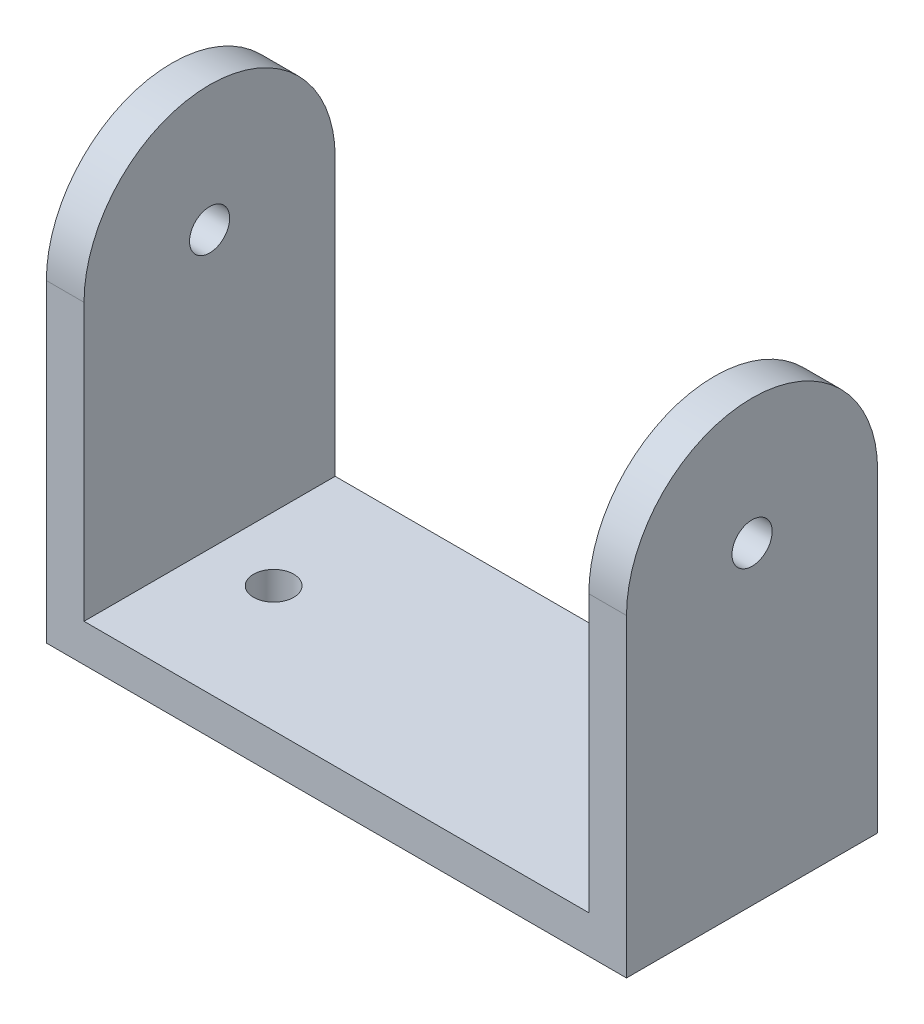
ISO-10303-21;
HEADER;
FILE_DESCRIPTION(('STEP AP214'),'2;1');
FILE_NAME('part.step','',(''),(''),'','','');
FILE_SCHEMA(('AUTOMOTIVE_DESIGN { 1 0 10303 214 1 1 1 1 }'));
ENDSEC;
DATA;
#1=APPLICATION_CONTEXT('core data for automotive mechanical design processes');
#2=APPLICATION_PROTOCOL_DEFINITION('international standard','automotive_design',2000,#1);
#3=PRODUCT_CONTEXT('',#1,'mechanical');
#4=PRODUCT('Part','Part','',(#3));
#5=PRODUCT_RELATED_PRODUCT_CATEGORY('part','',(#4));
#6=PRODUCT_DEFINITION_FORMATION('','',#4);
#7=PRODUCT_DEFINITION_CONTEXT('part definition',#1,'design');
#8=PRODUCT_DEFINITION('design','',#6,#7);
#9=PRODUCT_DEFINITION_SHAPE('','',#8);
#10=(LENGTH_UNIT() NAMED_UNIT(*) SI_UNIT(.MILLI.,.METRE.));
#11=(NAMED_UNIT(*) PLANE_ANGLE_UNIT() SI_UNIT($,.RADIAN.));
#12=(NAMED_UNIT(*) SI_UNIT($,.STERADIAN.) SOLID_ANGLE_UNIT());
#13=UNCERTAINTY_MEASURE_WITH_UNIT(LENGTH_MEASURE(1.E-05),#10,'distance_accuracy_value','');
#14=(GEOMETRIC_REPRESENTATION_CONTEXT(3) GLOBAL_UNCERTAINTY_ASSIGNED_CONTEXT((#13)) GLOBAL_UNIT_ASSIGNED_CONTEXT((#10,
#11,#12)) REPRESENTATION_CONTEXT('',''));
#15=CARTESIAN_POINT('',(0.,0.,0.));
#16=DIRECTION('',(0.,0.,1.));
#17=DIRECTION('',(1.,0.,0.));
#18=AXIS2_PLACEMENT_3D('',#15,#16,#17);
#19=CARTESIAN_POINT('',(-20.1,35.,10.));
#20=DIRECTION('',(1.,0.,0.));
#21=DIRECTION('',(0.,0.,-1.));
#22=AXIS2_PLACEMENT_3D('',#19,#20,#21);
#23=PLANE('',#22);
#24=CARTESIAN_POINT('',(-20.1,25.,0.));
#25=DIRECTION('',(1.,0.,0.));
#26=DIRECTION('',(0.,0.,-1.));
#27=AXIS2_PLACEMENT_3D('',#24,#25,#26);
#28=CIRCLE('',#27,1.6);
#29=CARTESIAN_POINT('',(-20.1,25.,-1.60000000000001));
#30=VERTEX_POINT('',#29);
#31=EDGE_CURVE('E152',#30,#30,#28,.T.);
#32=ORIENTED_EDGE('',*,*,#31,.F.);
#33=EDGE_LOOP('',(#32));
#34=FACE_BOUND('',#33,.T.);
#35=DIRECTION('',(0.,-1.,0.));
#36=VECTOR('',#35,1.);
#37=CARTESIAN_POINT('',(-20.1,35.,-10.));
#38=LINE('',#37,#36);
#39=CARTESIAN_POINT('',(-20.1,25.,-10.));
#40=VERTEX_POINT('',#39);
#41=CARTESIAN_POINT('',(-20.1,3.,-10.));
#42=VERTEX_POINT('',#41);
#43=EDGE_CURVE('E177',#40,#42,#38,.T.);
#44=ORIENTED_EDGE('',*,*,#43,.F.);
#45=CARTESIAN_POINT('',(-20.1,25.,0.));
#46=DIRECTION('',(1.,0.,0.));
#47=DIRECTION('',(0.,0.,-1.));
#48=AXIS2_PLACEMENT_3D('',#45,#46,#47);
#49=CIRCLE('',#48,10.);
#50=CARTESIAN_POINT('',(-20.1,25.,9.99999999999999));
#51=VERTEX_POINT('',#50);
#52=EDGE_CURVE('E170',#40,#51,#49,.T.);
#53=ORIENTED_EDGE('',*,*,#52,.T.);
#54=DIRECTION('',(0.,-1.,0.));
#55=VECTOR('',#54,1.);
#56=CARTESIAN_POINT('',(-20.1,35.,10.));
#57=LINE('',#56,#55);
#58=CARTESIAN_POINT('',(-20.1,3.,10.));
#59=VERTEX_POINT('',#58);
#60=EDGE_CURVE('E81',#51,#59,#57,.T.);
#61=ORIENTED_EDGE('',*,*,#60,.T.);
#62=DIRECTION('',(0.,0.,1.));
#63=VECTOR('',#62,1.);
#64=CARTESIAN_POINT('',(-20.1,3.,-10.));
#65=LINE('',#64,#63);
#66=EDGE_CURVE('E73',#42,#59,#65,.T.);
#67=ORIENTED_EDGE('',*,*,#66,.F.);
#68=EDGE_LOOP('',(#44,#53,#61,#67));
#69=FACE_BOUND('',#68,.T.);
#70=ADVANCED_FACE('F63',(#34,#69),#23,.T.);
#71=CARTESIAN_POINT('',(-23.1,35.,10.));
#72=DIRECTION('',(-1.,0.,0.));
#73=DIRECTION('',(0.,0.,1.));
#74=AXIS2_PLACEMENT_3D('',#71,#72,#73);
#75=PLANE('',#74);
#76=CARTESIAN_POINT('',(-23.1,25.,0.));
#77=DIRECTION('',(-1.,0.,0.));
#78=DIRECTION('',(0.,0.,1.));
#79=AXIS2_PLACEMENT_3D('',#76,#77,#78);
#80=CIRCLE('',#79,1.6);
#81=CARTESIAN_POINT('',(-23.1,25.,1.59999999999999));
#82=VERTEX_POINT('',#81);
#83=EDGE_CURVE('E230',#82,#82,#80,.T.);
#84=ORIENTED_EDGE('',*,*,#83,.F.);
#85=EDGE_LOOP('',(#84));
#86=FACE_BOUND('',#85,.T.);
#87=CARTESIAN_POINT('',(-23.1,25.,0.));
#88=DIRECTION('',(-1.,0.,0.));
#89=DIRECTION('',(0.,0.,1.));
#90=AXIS2_PLACEMENT_3D('',#87,#88,#89);
#91=CIRCLE('',#90,10.);
#92=CARTESIAN_POINT('',(-23.1,25.,9.99999999999999));
#93=VERTEX_POINT('',#92);
#94=CARTESIAN_POINT('',(-23.1,25.,-10.));
#95=VERTEX_POINT('',#94);
#96=EDGE_CURVE('E243',#93,#95,#91,.T.);
#97=ORIENTED_EDGE('',*,*,#96,.T.);
#98=DIRECTION('',(0.,-1.,0.));
#99=VECTOR('',#98,1.);
#100=CARTESIAN_POINT('',(-23.1,35.,-10.));
#101=LINE('',#100,#99);
#102=CARTESIAN_POINT('',(-23.1,0.,-10.));
#103=VERTEX_POINT('',#102);
#104=EDGE_CURVE('E181',#95,#103,#101,.T.);
#105=ORIENTED_EDGE('',*,*,#104,.T.);
#106=DIRECTION('',(0.,0.,-1.));
#107=VECTOR('',#106,1.);
#108=CARTESIAN_POINT('',(-23.1,0.,10.));
#109=LINE('',#108,#107);
#110=CARTESIAN_POINT('',(-23.1,0.,10.));
#111=VERTEX_POINT('',#110);
#112=EDGE_CURVE('E173',#111,#103,#109,.T.);
#113=ORIENTED_EDGE('',*,*,#112,.F.);
#114=DIRECTION('',(0.,-1.,0.));
#115=VECTOR('',#114,1.);
#116=CARTESIAN_POINT('',(-23.1,35.,10.));
#117=LINE('',#116,#115);
#118=EDGE_CURVE('E184',#93,#111,#117,.T.);
#119=ORIENTED_EDGE('',*,*,#118,.F.);
#120=EDGE_LOOP('',(#97,#105,#113,#119));
#121=FACE_BOUND('',#120,.T.);
#122=ADVANCED_FACE('F262',(#86,#121),#75,.T.);
#123=CARTESIAN_POINT('',(20.1,35.,10.));
#124=DIRECTION('',(-1.,0.,0.));
#125=DIRECTION('',(0.,0.,1.));
#126=AXIS2_PLACEMENT_3D('',#123,#124,#125);
#127=PLANE('',#126);
#128=CARTESIAN_POINT('',(20.1,25.,0.));
#129=DIRECTION('',(-1.,0.,0.));
#130=DIRECTION('',(0.,0.,1.));
#131=AXIS2_PLACEMENT_3D('',#128,#129,#130);
#132=CIRCLE('',#131,1.6);
#133=CARTESIAN_POINT('',(20.1,25.,1.59999999999999));
#134=VERTEX_POINT('',#133);
#135=EDGE_CURVE('E226',#134,#134,#132,.T.);
#136=ORIENTED_EDGE('',*,*,#135,.F.);
#137=EDGE_LOOP('',(#136));
#138=FACE_BOUND('',#137,.T.);
#139=CARTESIAN_POINT('',(20.1,25.,0.));
#140=DIRECTION('',(-1.,0.,0.));
#141=DIRECTION('',(0.,0.,1.));
#142=AXIS2_PLACEMENT_3D('',#139,#140,#141);
#143=CIRCLE('',#142,10.);
#144=CARTESIAN_POINT('',(20.1,25.,10.));
#145=VERTEX_POINT('',#144);
#146=CARTESIAN_POINT('',(20.1,25.,-10.));
#147=VERTEX_POINT('',#146);
#148=EDGE_CURVE('E240',#145,#147,#143,.T.);
#149=ORIENTED_EDGE('',*,*,#148,.T.);
#150=DIRECTION('',(0.,-1.,0.));
#151=VECTOR('',#150,1.);
#152=CARTESIAN_POINT('',(20.1,35.,-10.));
#153=LINE('',#152,#151);
#154=CARTESIAN_POINT('',(20.1,3.,-10.));
#155=VERTEX_POINT('',#154);
#156=EDGE_CURVE('E89',#147,#155,#153,.T.);
#157=ORIENTED_EDGE('',*,*,#156,.T.);
#158=DIRECTION('',(0.,0.,-1.));
#159=VECTOR('',#158,1.);
#160=CARTESIAN_POINT('',(20.1,3.,-10.));
#161=LINE('',#160,#159);
#162=CARTESIAN_POINT('',(20.1,3.,10.));
#163=VERTEX_POINT('',#162);
#164=EDGE_CURVE('E189',#163,#155,#161,.T.);
#165=ORIENTED_EDGE('',*,*,#164,.F.);
#166=DIRECTION('',(0.,-1.,0.));
#167=VECTOR('',#166,1.);
#168=CARTESIAN_POINT('',(20.1,35.,10.));
#169=LINE('',#168,#167);
#170=EDGE_CURVE('E164',#145,#163,#169,.T.);
#171=ORIENTED_EDGE('',*,*,#170,.F.);
#172=EDGE_LOOP('',(#149,#157,#165,#171));
#173=FACE_BOUND('',#172,.T.);
#174=ADVANCED_FACE('F283',(#138,#173),#127,.T.);
#175=CARTESIAN_POINT('',(23.1,35.,10.));
#176=DIRECTION('',(1.,0.,0.));
#177=DIRECTION('',(0.,0.,-1.));
#178=AXIS2_PLACEMENT_3D('',#175,#176,#177);
#179=PLANE('',#178);
#180=CARTESIAN_POINT('',(23.1,25.,0.));
#181=DIRECTION('',(1.,0.,0.));
#182=DIRECTION('',(0.,0.,-1.));
#183=AXIS2_PLACEMENT_3D('',#180,#181,#182);
#184=CIRCLE('',#183,1.6);
#185=CARTESIAN_POINT('',(23.1,25.,-1.6));
#186=VERTEX_POINT('',#185);
#187=EDGE_CURVE('E213',#186,#186,#184,.T.);
#188=ORIENTED_EDGE('',*,*,#187,.F.);
#189=EDGE_LOOP('',(#188));
#190=FACE_BOUND('',#189,.T.);
#191=DIRECTION('',(0.,-1.,0.));
#192=VECTOR('',#191,1.);
#193=CARTESIAN_POINT('',(23.1,35.,-10.));
#194=LINE('',#193,#192);
#195=CARTESIAN_POINT('',(23.1,25.,-10.));
#196=VERTEX_POINT('',#195);
#197=CARTESIAN_POINT('',(23.1,0.,-10.));
#198=VERTEX_POINT('',#197);
#199=EDGE_CURVE('E149',#196,#198,#194,.T.);
#200=ORIENTED_EDGE('',*,*,#199,.F.);
#201=CARTESIAN_POINT('',(23.1,25.,0.));
#202=DIRECTION('',(1.,0.,0.));
#203=DIRECTION('',(0.,0.,-1.));
#204=AXIS2_PLACEMENT_3D('',#201,#202,#203);
#205=CIRCLE('',#204,10.);
#206=CARTESIAN_POINT('',(23.1,25.,10.));
#207=VERTEX_POINT('',#206);
#208=EDGE_CURVE('E134',#196,#207,#205,.T.);
#209=ORIENTED_EDGE('',*,*,#208,.T.);
#210=DIRECTION('',(0.,-1.,0.));
#211=VECTOR('',#210,1.);
#212=CARTESIAN_POINT('',(23.1,35.,10.));
#213=LINE('',#212,#211);
#214=CARTESIAN_POINT('',(23.1,0.,10.));
#215=VERTEX_POINT('',#214);
#216=EDGE_CURVE('E159',#207,#215,#213,.T.);
#217=ORIENTED_EDGE('',*,*,#216,.T.);
#218=DIRECTION('',(0.,0.,1.));
#219=VECTOR('',#218,1.);
#220=CARTESIAN_POINT('',(23.1,0.,10.));
#221=LINE('',#220,#219);
#222=EDGE_CURVE('E157',#198,#215,#221,.T.);
#223=ORIENTED_EDGE('',*,*,#222,.F.);
#224=EDGE_LOOP('',(#200,#209,#217,#223));
#225=FACE_BOUND('',#224,.T.);
#226=ADVANCED_FACE('F155',(#190,#225),#179,.T.);
#227=CARTESIAN_POINT('',(-20.1,3.,10.));
#228=DIRECTION('',(0.,0.,-1.));
#229=DIRECTION('',(-1.,0.,0.));
#230=AXIS2_PLACEMENT_3D('',#227,#228,#229);
#231=PLANE('',#230);
#232=DIRECTION('',(1.,0.,0.));
#233=VECTOR('',#232,1.);
#234=CARTESIAN_POINT('',(-47.9,25.,9.99999999999999));
#235=LINE('',#234,#233);
#236=EDGE_CURVE('E239',#93,#51,#235,.T.);
#237=ORIENTED_EDGE('',*,*,#236,.F.);
#238=ORIENTED_EDGE('',*,*,#118,.T.);
#239=DIRECTION('',(1.,0.,0.));
#240=VECTOR('',#239,1.);
#241=CARTESIAN_POINT('',(-20.1,0.,10.));
#242=LINE('',#241,#240);
#243=EDGE_CURVE('E194',#111,#215,#242,.T.);
#244=ORIENTED_EDGE('',*,*,#243,.T.);
#245=ORIENTED_EDGE('',*,*,#216,.F.);
#246=EDGE_CURVE('E139',#145,#207,#235,.T.);
#247=ORIENTED_EDGE('',*,*,#246,.F.);
#248=ORIENTED_EDGE('',*,*,#170,.T.);
#249=DIRECTION('',(1.,0.,0.));
#250=VECTOR('',#249,1.);
#251=CARTESIAN_POINT('',(-20.1,3.,10.));
#252=LINE('',#251,#250);
#253=EDGE_CURVE('E12',#59,#163,#252,.T.);
#254=ORIENTED_EDGE('',*,*,#253,.F.);
#255=ORIENTED_EDGE('',*,*,#60,.F.);
#256=EDGE_LOOP('',(#237,#238,#244,#245,#247,#248,#254,#255));
#257=FACE_BOUND('',#256,.T.);
#258=ADVANCED_FACE('F253',(#257),#231,.F.);
#259=CARTESIAN_POINT('',(-20.1,3.,-10.));
#260=DIRECTION('',(0.,0.,1.));
#261=DIRECTION('',(1.,0.,0.));
#262=AXIS2_PLACEMENT_3D('',#259,#260,#261);
#263=PLANE('',#262);
#264=ORIENTED_EDGE('',*,*,#104,.F.);
#265=DIRECTION('',(1.,0.,0.));
#266=VECTOR('',#265,1.);
#267=CARTESIAN_POINT('',(-47.9,25.,-10.));
#268=LINE('',#267,#266);
#269=EDGE_CURVE('E144',#95,#40,#268,.T.);
#270=ORIENTED_EDGE('',*,*,#269,.T.);
#271=ORIENTED_EDGE('',*,*,#43,.T.);
#272=DIRECTION('',(-1.,0.,0.));
#273=VECTOR('',#272,1.);
#274=CARTESIAN_POINT('',(-20.1,3.,-10.));
#275=LINE('',#274,#273);
#276=EDGE_CURVE('E193',#155,#42,#275,.T.);
#277=ORIENTED_EDGE('',*,*,#276,.F.);
#278=ORIENTED_EDGE('',*,*,#156,.F.);
#279=EDGE_CURVE('E137',#147,#196,#268,.T.);
#280=ORIENTED_EDGE('',*,*,#279,.T.);
#281=ORIENTED_EDGE('',*,*,#199,.T.);
#282=DIRECTION('',(-1.,0.,0.));
#283=VECTOR('',#282,1.);
#284=CARTESIAN_POINT('',(-20.1,0.,-10.));
#285=LINE('',#284,#283);
#286=EDGE_CURVE('E180',#198,#103,#285,.T.);
#287=ORIENTED_EDGE('',*,*,#286,.T.);
#288=EDGE_LOOP('',(#264,#270,#271,#277,#278,#280,#281,#287));
#289=FACE_BOUND('',#288,.T.);
#290=ADVANCED_FACE('F65',(#289),#263,.F.);
#291=CARTESIAN_POINT('',(0.,3.,0.));
#292=DIRECTION('',(0.,1.,0.));
#293=DIRECTION('',(0.,0.,1.));
#294=AXIS2_PLACEMENT_3D('',#291,#292,#293);
#295=PLANE('',#294);
#296=CARTESIAN_POINT('',(-15.,3.,0.));
#297=DIRECTION('',(0.,1.,0.));
#298=DIRECTION('',(0.,0.,1.));
#299=AXIS2_PLACEMENT_3D('',#296,#297,#298);
#300=CIRCLE('',#299,1.6);
#301=CARTESIAN_POINT('',(-15.,3.,1.6));
#302=VERTEX_POINT('',#301);
#303=EDGE_CURVE('E207',#302,#302,#300,.T.);
#304=ORIENTED_EDGE('',*,*,#303,.F.);
#305=EDGE_LOOP('',(#304));
#306=FACE_BOUND('',#305,.T.);
#307=CARTESIAN_POINT('',(15.,3.,0.));
#308=DIRECTION('',(0.,1.,0.));
#309=DIRECTION('',(0.,0.,1.));
#310=AXIS2_PLACEMENT_3D('',#307,#308,#309);
#311=CIRCLE('',#310,1.6);
#312=CARTESIAN_POINT('',(15.,3.,1.6));
#313=VERTEX_POINT('',#312);
#314=EDGE_CURVE('E215',#313,#313,#311,.T.);
#315=ORIENTED_EDGE('',*,*,#314,.F.);
#316=EDGE_LOOP('',(#315));
#317=FACE_BOUND('',#316,.T.);
#318=ORIENTED_EDGE('',*,*,#164,.T.);
#319=ORIENTED_EDGE('',*,*,#276,.T.);
#320=ORIENTED_EDGE('',*,*,#66,.T.);
#321=ORIENTED_EDGE('',*,*,#253,.T.);
#322=EDGE_LOOP('',(#318,#319,#320,#321));
#323=FACE_BOUND('',#322,.T.);
#324=ADVANCED_FACE('F257',(#306,#317,#323),#295,.T.);
#325=CARTESIAN_POINT('',(0.,0.,0.));
#326=DIRECTION('',(0.,1.,0.));
#327=DIRECTION('',(0.,0.,1.));
#328=AXIS2_PLACEMENT_3D('',#325,#326,#327);
#329=PLANE('',#328);
#330=CARTESIAN_POINT('',(-15.,0.,0.));
#331=DIRECTION('',(0.,1.,0.));
#332=DIRECTION('',(0.,0.,1.));
#333=AXIS2_PLACEMENT_3D('',#330,#331,#332);
#334=CIRCLE('',#333,1.6);
#335=CARTESIAN_POINT('',(-15.,0.,1.6));
#336=VERTEX_POINT('',#335);
#337=EDGE_CURVE('E67',#336,#336,#334,.T.);
#338=ORIENTED_EDGE('',*,*,#337,.T.);
#339=EDGE_LOOP('',(#338));
#340=FACE_BOUND('',#339,.T.);
#341=CARTESIAN_POINT('',(15.,0.,0.));
#342=DIRECTION('',(0.,1.,0.));
#343=DIRECTION('',(0.,0.,1.));
#344=AXIS2_PLACEMENT_3D('',#341,#342,#343);
#345=CIRCLE('',#344,1.6);
#346=CARTESIAN_POINT('',(15.,0.,1.6));
#347=VERTEX_POINT('',#346);
#348=EDGE_CURVE('E204',#347,#347,#345,.T.);
#349=ORIENTED_EDGE('',*,*,#348,.T.);
#350=EDGE_LOOP('',(#349));
#351=FACE_BOUND('',#350,.T.);
#352=ORIENTED_EDGE('',*,*,#286,.F.);
#353=ORIENTED_EDGE('',*,*,#222,.T.);
#354=ORIENTED_EDGE('',*,*,#243,.F.);
#355=ORIENTED_EDGE('',*,*,#112,.T.);
#356=EDGE_LOOP('',(#352,#353,#354,#355));
#357=FACE_BOUND('',#356,.T.);
#358=ADVANCED_FACE('F266',(#340,#351,#357),#329,.F.);
#359=CARTESIAN_POINT('',(-47.9,25.,0.));
#360=DIRECTION('',(1.,0.,0.));
#361=DIRECTION('',(0.,0.,-1.));
#362=AXIS2_PLACEMENT_3D('',#359,#360,#361);
#363=CYLINDRICAL_SURFACE('',#362,10.);
#364=ORIENTED_EDGE('',*,*,#246,.T.);
#365=ORIENTED_EDGE('',*,*,#208,.F.);
#366=ORIENTED_EDGE('',*,*,#279,.F.);
#367=ORIENTED_EDGE('',*,*,#148,.F.);
#368=EDGE_LOOP('',(#364,#365,#366,#367));
#369=FACE_BOUND('',#368,.T.);
#370=ADVANCED_FACE('F136',(#369),#363,.T.);
#371=ORIENTED_EDGE('',*,*,#52,.F.);
#372=ORIENTED_EDGE('',*,*,#269,.F.);
#373=ORIENTED_EDGE('',*,*,#96,.F.);
#374=ORIENTED_EDGE('',*,*,#236,.T.);
#375=EDGE_LOOP('',(#371,#372,#373,#374));
#376=FACE_BOUND('',#375,.T.);
#377=ADVANCED_FACE('F260',(#376),#363,.T.);
#378=CARTESIAN_POINT('',(-47.9,25.,0.));
#379=DIRECTION('',(1.,0.,0.));
#380=DIRECTION('',(0.,0.,-1.));
#381=AXIS2_PLACEMENT_3D('',#378,#379,#380);
#382=CYLINDRICAL_SURFACE('',#381,1.6);
#383=ORIENTED_EDGE('',*,*,#135,.T.);
#384=EDGE_LOOP('',(#383));
#385=FACE_BOUND('',#384,.T.);
#386=ORIENTED_EDGE('',*,*,#187,.T.);
#387=EDGE_LOOP('',(#386));
#388=FACE_BOUND('',#387,.T.);
#389=ADVANCED_FACE('F294',(#385,#388),#382,.F.);
#390=ORIENTED_EDGE('',*,*,#31,.T.);
#391=EDGE_LOOP('',(#390));
#392=FACE_BOUND('',#391,.T.);
#393=ORIENTED_EDGE('',*,*,#83,.T.);
#394=EDGE_LOOP('',(#393));
#395=FACE_BOUND('',#394,.T.);
#396=ADVANCED_FACE('F297',(#392,#395),#382,.F.);
#397=CARTESIAN_POINT('',(15.,-68.,0.));
#398=DIRECTION('',(0.,1.,0.));
#399=DIRECTION('',(0.,0.,1.));
#400=AXIS2_PLACEMENT_3D('',#397,#398,#399);
#401=CYLINDRICAL_SURFACE('',#400,1.6);
#402=ORIENTED_EDGE('',*,*,#314,.T.);
#403=EDGE_LOOP('',(#402));
#404=FACE_BOUND('',#403,.T.);
#405=ORIENTED_EDGE('',*,*,#348,.F.);
#406=EDGE_LOOP('',(#405));
#407=FACE_BOUND('',#406,.T.);
#408=ADVANCED_FACE('F299',(#404,#407),#401,.F.);
#409=CARTESIAN_POINT('',(-15.,-68.,0.));
#410=DIRECTION('',(0.,1.,0.));
#411=DIRECTION('',(0.,0.,1.));
#412=AXIS2_PLACEMENT_3D('',#409,#410,#411);
#413=CYLINDRICAL_SURFACE('',#412,1.6);
#414=ORIENTED_EDGE('',*,*,#303,.T.);
#415=EDGE_LOOP('',(#414));
#416=FACE_BOUND('',#415,.T.);
#417=ORIENTED_EDGE('',*,*,#337,.F.);
#418=EDGE_LOOP('',(#417));
#419=FACE_BOUND('',#418,.T.);
#420=ADVANCED_FACE('F302',(#416,#419),#413,.F.);
#421=CLOSED_SHELL('',(#70,#122,#174,#226,#258,#290,#324,#358,#370,#377,#389,#396,#408,#420));
#422=MANIFOLD_SOLID_BREP('B2',#421);
#423=ADVANCED_BREP_SHAPE_REPRESENTATION('',(#18,#422),#14);
#424=SHAPE_DEFINITION_REPRESENTATION(#9,#423);
ENDSEC;
END-ISO-10303-21;
